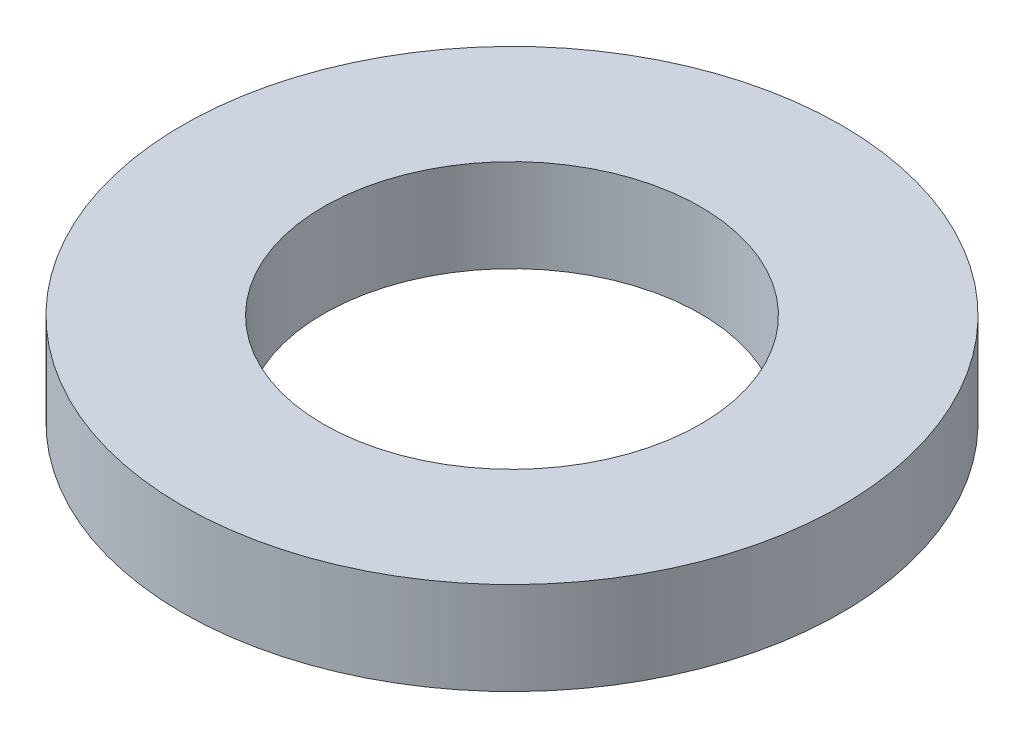
ISO-10303-21;
HEADER;
FILE_DESCRIPTION(('STEP AP214'),'2;1');
FILE_NAME('part.step','',(''),(''),'','','');
FILE_SCHEMA(('AUTOMOTIVE_DESIGN { 1 0 10303 214 1 1 1 1 }'));
ENDSEC;
DATA;
#1=APPLICATION_CONTEXT('core data for automotive mechanical design processes');
#2=APPLICATION_PROTOCOL_DEFINITION('international standard','automotive_design',2000,#1);
#3=PRODUCT_CONTEXT('',#1,'mechanical');
#4=PRODUCT('Part','Part','',(#3));
#5=PRODUCT_RELATED_PRODUCT_CATEGORY('part','',(#4));
#6=PRODUCT_DEFINITION_FORMATION('','',#4);
#7=PRODUCT_DEFINITION_CONTEXT('part definition',#1,'design');
#8=PRODUCT_DEFINITION('design','',#6,#7);
#9=PRODUCT_DEFINITION_SHAPE('','',#8);
#10=(LENGTH_UNIT() NAMED_UNIT(*) SI_UNIT(.MILLI.,.METRE.));
#11=(NAMED_UNIT(*) PLANE_ANGLE_UNIT() SI_UNIT($,.RADIAN.));
#12=(NAMED_UNIT(*) SI_UNIT($,.STERADIAN.) SOLID_ANGLE_UNIT());
#13=UNCERTAINTY_MEASURE_WITH_UNIT(LENGTH_MEASURE(1.E-05),#10,'distance_accuracy_value','');
#14=(GEOMETRIC_REPRESENTATION_CONTEXT(3) GLOBAL_UNCERTAINTY_ASSIGNED_CONTEXT((#13)) GLOBAL_UNIT_ASSIGNED_CONTEXT((#10,
#11,#12)) REPRESENTATION_CONTEXT('',''));
#15=CARTESIAN_POINT('',(0.,0.,0.));
#16=DIRECTION('',(0.,0.,1.));
#17=DIRECTION('',(1.,0.,0.));
#18=AXIS2_PLACEMENT_3D('',#15,#16,#17);
#19=CARTESIAN_POINT('',(0.,1.5,0.));
#20=DIRECTION('',(0.,1.,0.));
#21=DIRECTION('',(0.,0.,1.));
#22=AXIS2_PLACEMENT_3D('',#19,#20,#21);
#23=PLANE('',#22);
#24=CARTESIAN_POINT('',(0.,1.5,0.));
#25=DIRECTION('',(0.,1.,0.));
#26=DIRECTION('',(0.,0.,1.));
#27=AXIS2_PLACEMENT_3D('',#24,#25,#26);
#28=CIRCLE('',#27,5.334);
#29=CARTESIAN_POINT('',(0.,1.5,5.334));
#30=VERTEX_POINT('',#29);
#31=EDGE_CURVE('E10',#30,#30,#28,.T.);
#32=ORIENTED_EDGE('',*,*,#31,.T.);
#33=EDGE_LOOP('',(#32));
#34=FACE_BOUND('',#33,.T.);
#35=CARTESIAN_POINT('',(0.,1.5,0.));
#36=DIRECTION('',(0.,1.,0.));
#37=DIRECTION('',(0.,0.,1.));
#38=AXIS2_PLACEMENT_3D('',#35,#36,#37);
#39=CIRCLE('',#38,3.05);
#40=CARTESIAN_POINT('',(0.,1.5,3.05));
#41=VERTEX_POINT('',#40);
#42=EDGE_CURVE('E42',#41,#41,#39,.T.);
#43=ORIENTED_EDGE('',*,*,#42,.F.);
#44=EDGE_LOOP('',(#43));
#45=FACE_BOUND('',#44,.T.);
#46=ADVANCED_FACE('F31',(#34,#45),#23,.T.);
#47=CARTESIAN_POINT('',(0.,0.,0.));
#48=DIRECTION('',(0.,1.,0.));
#49=DIRECTION('',(0.,0.,1.));
#50=AXIS2_PLACEMENT_3D('',#47,#48,#49);
#51=PLANE('',#50);
#52=CARTESIAN_POINT('',(0.,0.,0.));
#53=DIRECTION('',(0.,1.,0.));
#54=DIRECTION('',(0.,0.,1.));
#55=AXIS2_PLACEMENT_3D('',#52,#53,#54);
#56=CIRCLE('',#55,5.334);
#57=CARTESIAN_POINT('',(0.,0.,5.334));
#58=VERTEX_POINT('',#57);
#59=EDGE_CURVE('E35',#58,#58,#56,.T.);
#60=ORIENTED_EDGE('',*,*,#59,.F.);
#61=EDGE_LOOP('',(#60));
#62=FACE_BOUND('',#61,.T.);
#63=CARTESIAN_POINT('',(0.,0.,0.));
#64=DIRECTION('',(0.,1.,0.));
#65=DIRECTION('',(0.,0.,1.));
#66=AXIS2_PLACEMENT_3D('',#63,#64,#65);
#67=CIRCLE('',#66,3.05);
#68=CARTESIAN_POINT('',(0.,0.,3.05));
#69=VERTEX_POINT('',#68);
#70=EDGE_CURVE('E44',#69,#69,#67,.T.);
#71=ORIENTED_EDGE('',*,*,#70,.T.);
#72=EDGE_LOOP('',(#71));
#73=FACE_BOUND('',#72,.T.);
#74=ADVANCED_FACE('F54',(#62,#73),#51,.F.);
#75=CARTESIAN_POINT('',(0.,1.5,0.));
#76=DIRECTION('',(0.,-1.,0.));
#77=DIRECTION('',(0.,0.,-1.));
#78=AXIS2_PLACEMENT_3D('',#75,#76,#77);
#79=CYLINDRICAL_SURFACE('',#78,5.334);
#80=ORIENTED_EDGE('',*,*,#31,.F.);
#81=EDGE_LOOP('',(#80));
#82=FACE_BOUND('',#81,.T.);
#83=ORIENTED_EDGE('',*,*,#59,.T.);
#84=EDGE_LOOP('',(#83));
#85=FACE_BOUND('',#84,.T.);
#86=ADVANCED_FACE('F33',(#82,#85),#79,.T.);
#87=CARTESIAN_POINT('',(0.,1.5,0.));
#88=DIRECTION('',(0.,-1.,0.));
#89=DIRECTION('',(0.,0.,-1.));
#90=AXIS2_PLACEMENT_3D('',#87,#88,#89);
#91=CYLINDRICAL_SURFACE('',#90,3.05);
#92=ORIENTED_EDGE('',*,*,#42,.T.);
#93=EDGE_LOOP('',(#92));
#94=FACE_BOUND('',#93,.T.);
#95=ORIENTED_EDGE('',*,*,#70,.F.);
#96=EDGE_LOOP('',(#95));
#97=FACE_BOUND('',#96,.T.);
#98=ADVANCED_FACE('F50',(#94,#97),#91,.F.);
#99=CLOSED_SHELL('',(#46,#74,#86,#98));
#100=MANIFOLD_SOLID_BREP('B2',#99);
#101=ADVANCED_BREP_SHAPE_REPRESENTATION('',(#18,#100),#14);
#102=SHAPE_DEFINITION_REPRESENTATION(#9,#101);
ENDSEC;
END-ISO-10303-21;
